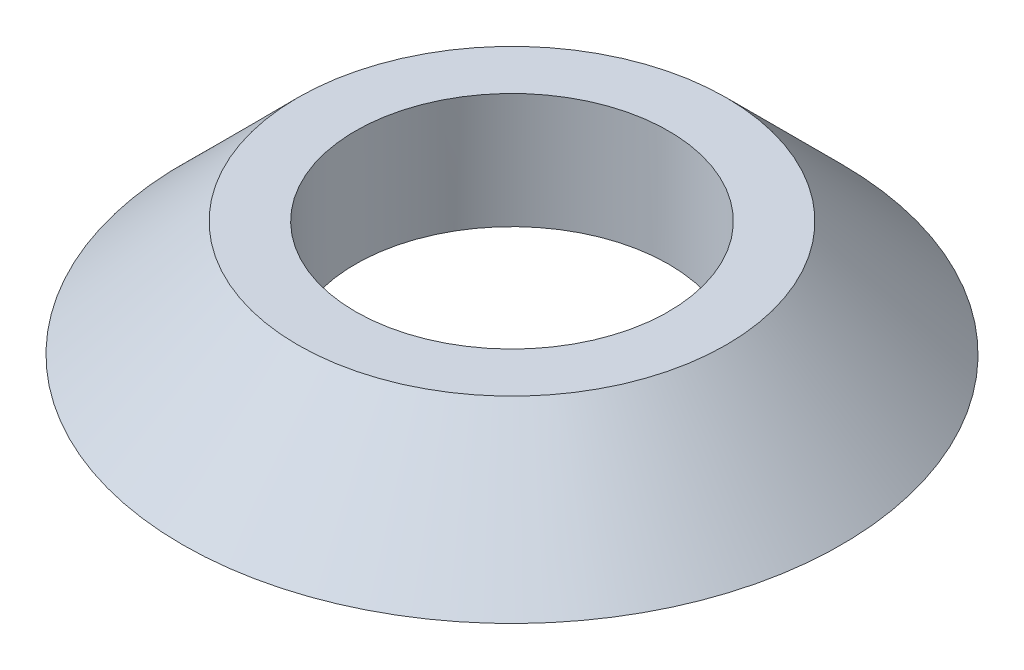
ISO-10303-21;
HEADER;
FILE_DESCRIPTION(('STEP AP214'),'2;1');
FILE_NAME('part.step','',(''),(''),'','','');
FILE_SCHEMA(('AUTOMOTIVE_DESIGN { 1 0 10303 214 1 1 1 1 }'));
ENDSEC;
DATA;
#1=APPLICATION_CONTEXT('core data for automotive mechanical design processes');
#2=APPLICATION_PROTOCOL_DEFINITION('international standard','automotive_design',2000,#1);
#3=PRODUCT_CONTEXT('',#1,'mechanical');
#4=PRODUCT('Part','Part','',(#3));
#5=PRODUCT_RELATED_PRODUCT_CATEGORY('part','',(#4));
#6=PRODUCT_DEFINITION_FORMATION('','',#4);
#7=PRODUCT_DEFINITION_CONTEXT('part definition',#1,'design');
#8=PRODUCT_DEFINITION('design','',#6,#7);
#9=PRODUCT_DEFINITION_SHAPE('','',#8);
#10=(LENGTH_UNIT() NAMED_UNIT(*) SI_UNIT(.MILLI.,.METRE.));
#11=(NAMED_UNIT(*) PLANE_ANGLE_UNIT() SI_UNIT($,.RADIAN.));
#12=(NAMED_UNIT(*) SI_UNIT($,.STERADIAN.) SOLID_ANGLE_UNIT());
#13=UNCERTAINTY_MEASURE_WITH_UNIT(LENGTH_MEASURE(1.E-05),#10,'distance_accuracy_value','');
#14=(GEOMETRIC_REPRESENTATION_CONTEXT(3) GLOBAL_UNCERTAINTY_ASSIGNED_CONTEXT((#13)) GLOBAL_UNIT_ASSIGNED_CONTEXT((#10,
#11,#12)) REPRESENTATION_CONTEXT('',''));
#15=CARTESIAN_POINT('',(0.,0.,0.));
#16=DIRECTION('',(0.,0.,1.));
#17=DIRECTION('',(1.,0.,0.));
#18=AXIS2_PLACEMENT_3D('',#15,#16,#17);
#19=CARTESIAN_POINT('',(0.,0.,0.));
#20=DIRECTION('',(0.,-1.,0.));
#21=DIRECTION('',(0.,0.,-1.));
#22=AXIS2_PLACEMENT_3D('',#19,#20,#21);
#23=PLANE('',#22);
#24=CARTESIAN_POINT('',(0.,0.,0.));
#25=DIRECTION('',(0.,-1.,0.));
#26=DIRECTION('',(0.,0.,-1.));
#27=AXIS2_PLACEMENT_3D('',#24,#25,#26);
#28=CIRCLE('',#27,9.5);
#29=CARTESIAN_POINT('',(0.,0.,-9.5));
#30=VERTEX_POINT('',#29);
#31=EDGE_CURVE('E49',#30,#30,#28,.T.);
#32=ORIENTED_EDGE('',*,*,#31,.F.);
#33=EDGE_LOOP('',(#32));
#34=FACE_BOUND('',#33,.T.);
#35=CARTESIAN_POINT('',(0.,0.,0.));
#36=DIRECTION('',(0.,-1.,0.));
#37=DIRECTION('',(0.,0.,-1.));
#38=AXIS2_PLACEMENT_3D('',#35,#36,#37);
#39=CIRCLE('',#38,20.);
#40=CARTESIAN_POINT('',(0.,0.,-20.));
#41=VERTEX_POINT('',#40);
#42=EDGE_CURVE('E10',#41,#41,#39,.T.);
#43=ORIENTED_EDGE('',*,*,#42,.T.);
#44=EDGE_LOOP('',(#43));
#45=FACE_BOUND('',#44,.T.);
#46=ADVANCED_FACE('F39',(#34,#45),#23,.T.);
#47=CARTESIAN_POINT('',(0.,0.,0.));
#48=DIRECTION('',(0.,-1.,0.));
#49=DIRECTION('',(0.,0.,-1.));
#50=AXIS2_PLACEMENT_3D('',#47,#48,#49);
#51=CONICAL_SURFACE('',#50,20.,0.785398163397448);
#52=CARTESIAN_POINT('',(0.,7.,0.));
#53=DIRECTION('',(0.,-1.,0.));
#54=DIRECTION('',(0.,0.,-1.));
#55=AXIS2_PLACEMENT_3D('',#52,#53,#54);
#56=CIRCLE('',#55,13.);
#57=CARTESIAN_POINT('',(0.,7.,-13.));
#58=VERTEX_POINT('',#57);
#59=EDGE_CURVE('E45',#58,#58,#56,.T.);
#60=ORIENTED_EDGE('',*,*,#59,.T.);
#61=EDGE_LOOP('',(#60));
#62=FACE_BOUND('',#61,.T.);
#63=ORIENTED_EDGE('',*,*,#42,.F.);
#64=EDGE_LOOP('',(#63));
#65=FACE_BOUND('',#64,.T.);
#66=ADVANCED_FACE('F64',(#62,#65),#51,.T.);
#67=CARTESIAN_POINT('',(0.,7.,0.));
#68=DIRECTION('',(0.,1.,0.));
#69=DIRECTION('',(0.,0.,1.));
#70=AXIS2_PLACEMENT_3D('',#67,#68,#69);
#71=PLANE('',#70);
#72=CARTESIAN_POINT('',(0.,7.,0.));
#73=DIRECTION('',(0.,1.,0.));
#74=DIRECTION('',(0.,0.,1.));
#75=AXIS2_PLACEMENT_3D('',#72,#73,#74);
#76=CIRCLE('',#75,9.5);
#77=CARTESIAN_POINT('',(0.,7.,9.5));
#78=VERTEX_POINT('',#77);
#79=EDGE_CURVE('E53',#78,#78,#76,.T.);
#80=ORIENTED_EDGE('',*,*,#79,.F.);
#81=EDGE_LOOP('',(#80));
#82=FACE_BOUND('',#81,.T.);
#83=ORIENTED_EDGE('',*,*,#59,.F.);
#84=EDGE_LOOP('',(#83));
#85=FACE_BOUND('',#84,.T.);
#86=ADVANCED_FACE('F61',(#82,#85),#71,.T.);
#87=CARTESIAN_POINT('',(0.,-3.,0.));
#88=DIRECTION('',(0.,1.,0.));
#89=DIRECTION('',(0.,0.,1.));
#90=AXIS2_PLACEMENT_3D('',#87,#88,#89);
#91=CYLINDRICAL_SURFACE('',#90,9.5);
#92=ORIENTED_EDGE('',*,*,#31,.T.);
#93=EDGE_LOOP('',(#92));
#94=FACE_BOUND('',#93,.T.);
#95=ORIENTED_EDGE('',*,*,#79,.T.);
#96=EDGE_LOOP('',(#95));
#97=FACE_BOUND('',#96,.T.);
#98=ADVANCED_FACE('F59',(#94,#97),#91,.F.);
#99=CLOSED_SHELL('',(#46,#66,#86,#98));
#100=MANIFOLD_SOLID_BREP('B2',#99);
#101=ADVANCED_BREP_SHAPE_REPRESENTATION('',(#18,#100),#14);
#102=SHAPE_DEFINITION_REPRESENTATION(#9,#101);
ENDSEC;
END-ISO-10303-21;
